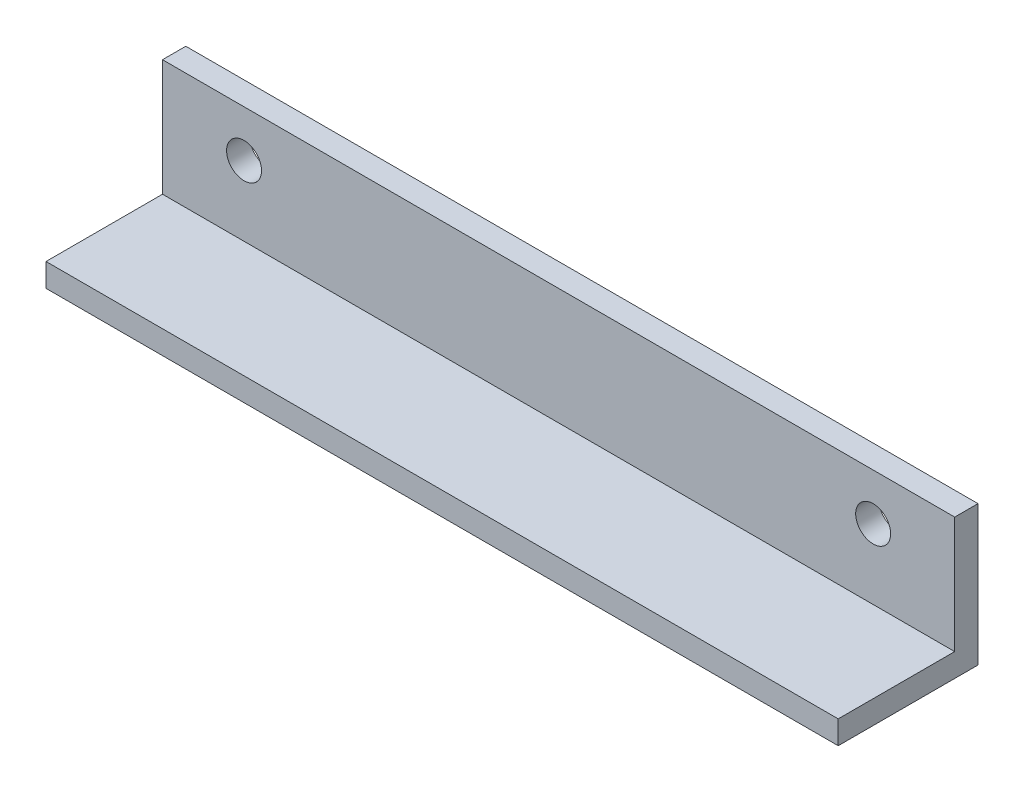
ISO-10303-21;
HEADER;
FILE_DESCRIPTION(('STEP AP214'),'2;1');
FILE_NAME('part.step','',(''),(''),'','','');
FILE_SCHEMA(('AUTOMOTIVE_DESIGN { 1 0 10303 214 1 1 1 1 }'));
ENDSEC;
DATA;
#1=APPLICATION_CONTEXT('core data for automotive mechanical design processes');
#2=APPLICATION_PROTOCOL_DEFINITION('international standard','automotive_design',2000,#1);
#3=PRODUCT_CONTEXT('',#1,'mechanical');
#4=PRODUCT('Part','Part','',(#3));
#5=PRODUCT_RELATED_PRODUCT_CATEGORY('part','',(#4));
#6=PRODUCT_DEFINITION_FORMATION('','',#4);
#7=PRODUCT_DEFINITION_CONTEXT('part definition',#1,'design');
#8=PRODUCT_DEFINITION('design','',#6,#7);
#9=PRODUCT_DEFINITION_SHAPE('','',#8);
#10=(LENGTH_UNIT() NAMED_UNIT(*) SI_UNIT(.MILLI.,.METRE.));
#11=(NAMED_UNIT(*) PLANE_ANGLE_UNIT() SI_UNIT($,.RADIAN.));
#12=(NAMED_UNIT(*) SI_UNIT($,.STERADIAN.) SOLID_ANGLE_UNIT());
#13=UNCERTAINTY_MEASURE_WITH_UNIT(LENGTH_MEASURE(1.E-05),#10,'distance_accuracy_value','');
#14=(GEOMETRIC_REPRESENTATION_CONTEXT(3) GLOBAL_UNCERTAINTY_ASSIGNED_CONTEXT((#13)) GLOBAL_UNIT_ASSIGNED_CONTEXT((#10,
#11,#12)) REPRESENTATION_CONTEXT('',''));
#15=CARTESIAN_POINT('',(0.,0.,0.));
#16=DIRECTION('',(0.,0.,1.));
#17=DIRECTION('',(1.,0.,0.));
#18=AXIS2_PLACEMENT_3D('',#15,#16,#17);
#19=CARTESIAN_POINT('',(107.95,0.,0.));
#20=DIRECTION('',(0.,0.,1.));
#21=DIRECTION('',(1.,0.,0.));
#22=AXIS2_PLACEMENT_3D('',#19,#20,#21);
#23=PLANE('',#22);
#24=CARTESIAN_POINT('',(-85.725,25.4,0.));
#25=DIRECTION('',(0.,0.,1.));
#26=DIRECTION('',(1.,0.,0.));
#27=AXIS2_PLACEMENT_3D('',#24,#25,#26);
#28=CIRCLE('',#27,4.7625);
#29=CARTESIAN_POINT('',(-80.9625,25.4,0.));
#30=VERTEX_POINT('',#29);
#31=EDGE_CURVE('E161',#30,#30,#28,.T.);
#32=ORIENTED_EDGE('',*,*,#31,.T.);
#33=EDGE_LOOP('',(#32));
#34=FACE_BOUND('',#33,.T.);
#35=CARTESIAN_POINT('',(85.725,25.4,0.));
#36=DIRECTION('',(0.,0.,1.));
#37=DIRECTION('',(1.,0.,0.));
#38=AXIS2_PLACEMENT_3D('',#35,#36,#37);
#39=CIRCLE('',#38,4.7625);
#40=CARTESIAN_POINT('',(90.4875,25.4,0.));
#41=VERTEX_POINT('',#40);
#42=EDGE_CURVE('E120',#41,#41,#39,.T.);
#43=ORIENTED_EDGE('',*,*,#42,.T.);
#44=EDGE_LOOP('',(#43));
#45=FACE_BOUND('',#44,.T.);
#46=DIRECTION('',(0.,1.,0.));
#47=VECTOR('',#46,1.);
#48=CARTESIAN_POINT('',(-107.95,0.,0.));
#49=LINE('',#48,#47);
#50=CARTESIAN_POINT('',(-107.95,0.,0.));
#51=VERTEX_POINT('',#50);
#52=CARTESIAN_POINT('',(-107.95,38.1,0.));
#53=VERTEX_POINT('',#52);
#54=EDGE_CURVE('E116',#51,#53,#49,.T.);
#55=ORIENTED_EDGE('',*,*,#54,.T.);
#56=DIRECTION('',(-1.,0.,0.));
#57=VECTOR('',#56,1.);
#58=CARTESIAN_POINT('',(107.95,38.1,0.));
#59=LINE('',#58,#57);
#60=CARTESIAN_POINT('',(107.95,38.1,0.));
#61=VERTEX_POINT('',#60);
#62=EDGE_CURVE('E11',#61,#53,#59,.T.);
#63=ORIENTED_EDGE('',*,*,#62,.F.);
#64=DIRECTION('',(0.,1.,0.));
#65=VECTOR('',#64,1.);
#66=CARTESIAN_POINT('',(107.95,0.,0.));
#67=LINE('',#66,#65);
#68=CARTESIAN_POINT('',(107.95,0.,0.));
#69=VERTEX_POINT('',#68);
#70=EDGE_CURVE('E81',#69,#61,#67,.T.);
#71=ORIENTED_EDGE('',*,*,#70,.F.);
#72=DIRECTION('',(-1.,0.,0.));
#73=VECTOR('',#72,1.);
#74=CARTESIAN_POINT('',(107.95,0.,0.));
#75=LINE('',#74,#73);
#76=EDGE_CURVE('E112',#69,#51,#75,.T.);
#77=ORIENTED_EDGE('',*,*,#76,.T.);
#78=EDGE_LOOP('',(#55,#63,#71,#77));
#79=FACE_BOUND('',#78,.T.);
#80=ADVANCED_FACE('F35',(#34,#45,#79),#23,.F.);
#81=CARTESIAN_POINT('',(107.95,38.1,6.35));
#82=DIRECTION('',(0.,1.,0.));
#83=DIRECTION('',(0.,0.,1.));
#84=AXIS2_PLACEMENT_3D('',#81,#82,#83);
#85=PLANE('',#84);
#86=DIRECTION('',(0.,0.,-1.));
#87=VECTOR('',#86,1.);
#88=CARTESIAN_POINT('',(-107.95,38.1,6.35));
#89=LINE('',#88,#87);
#90=CARTESIAN_POINT('',(-107.95,38.1,6.35));
#91=VERTEX_POINT('',#90);
#92=EDGE_CURVE('E119',#91,#53,#89,.T.);
#93=ORIENTED_EDGE('',*,*,#92,.F.);
#94=DIRECTION('',(-1.,0.,0.));
#95=VECTOR('',#94,1.);
#96=CARTESIAN_POINT('',(107.95,38.1,6.35));
#97=LINE('',#96,#95);
#98=CARTESIAN_POINT('',(107.95,38.1,6.35));
#99=VERTEX_POINT('',#98);
#100=EDGE_CURVE('E43',#99,#91,#97,.T.);
#101=ORIENTED_EDGE('',*,*,#100,.F.);
#102=DIRECTION('',(0.,0.,-1.));
#103=VECTOR('',#102,1.);
#104=CARTESIAN_POINT('',(107.95,38.1,6.35));
#105=LINE('',#104,#103);
#106=EDGE_CURVE('E172',#99,#61,#105,.T.);
#107=ORIENTED_EDGE('',*,*,#106,.T.);
#108=ORIENTED_EDGE('',*,*,#62,.T.);
#109=EDGE_LOOP('',(#93,#101,#107,#108));
#110=FACE_BOUND('',#109,.T.);
#111=ADVANCED_FACE('F138',(#110),#85,.T.);
#112=CARTESIAN_POINT('',(107.95,0.,6.35));
#113=DIRECTION('',(0.,0.,1.));
#114=DIRECTION('',(1.,0.,0.));
#115=AXIS2_PLACEMENT_3D('',#112,#113,#114);
#116=PLANE('',#115);
#117=CARTESIAN_POINT('',(-85.725,25.4,6.35));
#118=DIRECTION('',(0.,0.,1.));
#119=DIRECTION('',(1.,0.,0.));
#120=AXIS2_PLACEMENT_3D('',#117,#118,#119);
#121=CIRCLE('',#120,4.7625);
#122=CARTESIAN_POINT('',(-80.9625,25.4,6.35));
#123=VERTEX_POINT('',#122);
#124=EDGE_CURVE('E174',#123,#123,#121,.T.);
#125=ORIENTED_EDGE('',*,*,#124,.F.);
#126=EDGE_LOOP('',(#125));
#127=FACE_BOUND('',#126,.T.);
#128=CARTESIAN_POINT('',(85.725,25.4,6.35));
#129=DIRECTION('',(0.,0.,1.));
#130=DIRECTION('',(1.,0.,0.));
#131=AXIS2_PLACEMENT_3D('',#128,#129,#130);
#132=CIRCLE('',#131,4.7625);
#133=CARTESIAN_POINT('',(90.4875,25.4,6.35));
#134=VERTEX_POINT('',#133);
#135=EDGE_CURVE('E165',#134,#134,#132,.T.);
#136=ORIENTED_EDGE('',*,*,#135,.F.);
#137=EDGE_LOOP('',(#136));
#138=FACE_BOUND('',#137,.T.);
#139=DIRECTION('',(0.,1.,0.));
#140=VECTOR('',#139,1.);
#141=CARTESIAN_POINT('',(-107.95,0.,6.35));
#142=LINE('',#141,#140);
#143=CARTESIAN_POINT('',(-107.95,6.35,6.35));
#144=VERTEX_POINT('',#143);
#145=EDGE_CURVE('E123',#144,#91,#142,.T.);
#146=ORIENTED_EDGE('',*,*,#145,.F.);
#147=DIRECTION('',(-1.,0.,0.));
#148=VECTOR('',#147,1.);
#149=CARTESIAN_POINT('',(107.95,6.35,6.35));
#150=LINE('',#149,#148);
#151=CARTESIAN_POINT('',(107.95,6.35,6.35));
#152=VERTEX_POINT('',#151);
#153=EDGE_CURVE('E102',#152,#144,#150,.T.);
#154=ORIENTED_EDGE('',*,*,#153,.F.);
#155=DIRECTION('',(0.,1.,0.));
#156=VECTOR('',#155,1.);
#157=CARTESIAN_POINT('',(107.95,0.,6.35));
#158=LINE('',#157,#156);
#159=EDGE_CURVE('E108',#152,#99,#158,.T.);
#160=ORIENTED_EDGE('',*,*,#159,.T.);
#161=ORIENTED_EDGE('',*,*,#100,.T.);
#162=EDGE_LOOP('',(#146,#154,#160,#161));
#163=FACE_BOUND('',#162,.T.);
#164=ADVANCED_FACE('F135',(#127,#138,#163),#116,.T.);
#165=CARTESIAN_POINT('',(107.95,6.35,38.1));
#166=DIRECTION('',(0.,1.,0.));
#167=DIRECTION('',(0.,0.,1.));
#168=AXIS2_PLACEMENT_3D('',#165,#166,#167);
#169=PLANE('',#168);
#170=DIRECTION('',(0.,0.,-1.));
#171=VECTOR('',#170,1.);
#172=CARTESIAN_POINT('',(-107.95,6.35,38.1));
#173=LINE('',#172,#171);
#174=CARTESIAN_POINT('',(-107.95,6.35,38.1));
#175=VERTEX_POINT('',#174);
#176=EDGE_CURVE('E97',#175,#144,#173,.T.);
#177=ORIENTED_EDGE('',*,*,#176,.F.);
#178=DIRECTION('',(-1.,0.,0.));
#179=VECTOR('',#178,1.);
#180=CARTESIAN_POINT('',(107.95,6.35,38.1));
#181=LINE('',#180,#179);
#182=CARTESIAN_POINT('',(107.95,6.35,38.1));
#183=VERTEX_POINT('',#182);
#184=EDGE_CURVE('E92',#183,#175,#181,.T.);
#185=ORIENTED_EDGE('',*,*,#184,.F.);
#186=DIRECTION('',(0.,0.,-1.));
#187=VECTOR('',#186,1.);
#188=CARTESIAN_POINT('',(107.95,6.35,38.1));
#189=LINE('',#188,#187);
#190=EDGE_CURVE('E95',#183,#152,#189,.T.);
#191=ORIENTED_EDGE('',*,*,#190,.T.);
#192=ORIENTED_EDGE('',*,*,#153,.T.);
#193=EDGE_LOOP('',(#177,#185,#191,#192));
#194=FACE_BOUND('',#193,.T.);
#195=ADVANCED_FACE('F94',(#194),#169,.T.);
#196=CARTESIAN_POINT('',(107.95,0.,38.1));
#197=DIRECTION('',(0.,0.,1.));
#198=DIRECTION('',(1.,0.,0.));
#199=AXIS2_PLACEMENT_3D('',#196,#197,#198);
#200=PLANE('',#199);
#201=DIRECTION('',(0.,1.,0.));
#202=VECTOR('',#201,1.);
#203=CARTESIAN_POINT('',(-107.95,0.,38.1));
#204=LINE('',#203,#202);
#205=CARTESIAN_POINT('',(-107.95,0.,38.1));
#206=VERTEX_POINT('',#205);
#207=EDGE_CURVE('E127',#206,#175,#204,.T.);
#208=ORIENTED_EDGE('',*,*,#207,.F.);
#209=DIRECTION('',(-1.,0.,0.));
#210=VECTOR('',#209,1.);
#211=CARTESIAN_POINT('',(107.95,0.,38.1));
#212=LINE('',#211,#210);
#213=CARTESIAN_POINT('',(107.95,0.,38.1));
#214=VERTEX_POINT('',#213);
#215=EDGE_CURVE('E72',#214,#206,#212,.T.);
#216=ORIENTED_EDGE('',*,*,#215,.F.);
#217=DIRECTION('',(0.,1.,0.));
#218=VECTOR('',#217,1.);
#219=CARTESIAN_POINT('',(107.95,0.,38.1));
#220=LINE('',#219,#218);
#221=EDGE_CURVE('E106',#214,#183,#220,.T.);
#222=ORIENTED_EDGE('',*,*,#221,.T.);
#223=ORIENTED_EDGE('',*,*,#184,.T.);
#224=EDGE_LOOP('',(#208,#216,#222,#223));
#225=FACE_BOUND('',#224,.T.);
#226=ADVANCED_FACE('F110',(#225),#200,.T.);
#227=CARTESIAN_POINT('',(107.95,0.,38.1));
#228=DIRECTION('',(0.,1.,0.));
#229=DIRECTION('',(0.,0.,1.));
#230=AXIS2_PLACEMENT_3D('',#227,#228,#229);
#231=PLANE('',#230);
#232=DIRECTION('',(0.,0.,-1.));
#233=VECTOR('',#232,1.);
#234=CARTESIAN_POINT('',(-107.95,0.,38.1));
#235=LINE('',#234,#233);
#236=EDGE_CURVE('E75',#206,#51,#235,.T.);
#237=ORIENTED_EDGE('',*,*,#236,.T.);
#238=ORIENTED_EDGE('',*,*,#76,.F.);
#239=DIRECTION('',(0.,0.,-1.));
#240=VECTOR('',#239,1.);
#241=CARTESIAN_POINT('',(107.95,0.,38.1));
#242=LINE('',#241,#240);
#243=EDGE_CURVE('E51',#214,#69,#242,.T.);
#244=ORIENTED_EDGE('',*,*,#243,.F.);
#245=ORIENTED_EDGE('',*,*,#215,.T.);
#246=EDGE_LOOP('',(#237,#238,#244,#245));
#247=FACE_BOUND('',#246,.T.);
#248=ADVANCED_FACE('F143',(#247),#231,.F.);
#249=CARTESIAN_POINT('',(107.95,0.,0.));
#250=DIRECTION('',(-1.,0.,0.));
#251=DIRECTION('',(0.,0.,1.));
#252=AXIS2_PLACEMENT_3D('',#249,#250,#251);
#253=PLANE('',#252);
#254=ORIENTED_EDGE('',*,*,#70,.T.);
#255=ORIENTED_EDGE('',*,*,#106,.F.);
#256=ORIENTED_EDGE('',*,*,#159,.F.);
#257=ORIENTED_EDGE('',*,*,#190,.F.);
#258=ORIENTED_EDGE('',*,*,#221,.F.);
#259=ORIENTED_EDGE('',*,*,#243,.T.);
#260=EDGE_LOOP('',(#254,#255,#256,#257,#258,#259));
#261=FACE_BOUND('',#260,.T.);
#262=ADVANCED_FACE('F105',(#261),#253,.F.);
#263=CARTESIAN_POINT('',(-107.95,0.,0.));
#264=DIRECTION('',(-1.,0.,0.));
#265=DIRECTION('',(0.,0.,1.));
#266=AXIS2_PLACEMENT_3D('',#263,#264,#265);
#267=PLANE('',#266);
#268=ORIENTED_EDGE('',*,*,#54,.F.);
#269=ORIENTED_EDGE('',*,*,#236,.F.);
#270=ORIENTED_EDGE('',*,*,#207,.T.);
#271=ORIENTED_EDGE('',*,*,#176,.T.);
#272=ORIENTED_EDGE('',*,*,#145,.T.);
#273=ORIENTED_EDGE('',*,*,#92,.T.);
#274=EDGE_LOOP('',(#268,#269,#270,#271,#272,#273));
#275=FACE_BOUND('',#274,.T.);
#276=ADVANCED_FACE('F141',(#275),#267,.T.);
#277=CARTESIAN_POINT('',(85.725,25.4,6.35));
#278=DIRECTION('',(0.,0.,1.));
#279=DIRECTION('',(1.,0.,0.));
#280=AXIS2_PLACEMENT_3D('',#277,#278,#279);
#281=CYLINDRICAL_SURFACE('',#280,4.7625);
#282=ORIENTED_EDGE('',*,*,#42,.F.);
#283=EDGE_LOOP('',(#282));
#284=FACE_BOUND('',#283,.T.);
#285=ORIENTED_EDGE('',*,*,#135,.T.);
#286=EDGE_LOOP('',(#285));
#287=FACE_BOUND('',#286,.T.);
#288=ADVANCED_FACE('F185',(#284,#287),#281,.F.);
#289=CARTESIAN_POINT('',(-85.725,25.4,6.35));
#290=DIRECTION('',(0.,0.,1.));
#291=DIRECTION('',(1.,0.,0.));
#292=AXIS2_PLACEMENT_3D('',#289,#290,#291);
#293=CYLINDRICAL_SURFACE('',#292,4.7625);
#294=ORIENTED_EDGE('',*,*,#31,.F.);
#295=EDGE_LOOP('',(#294));
#296=FACE_BOUND('',#295,.T.);
#297=ORIENTED_EDGE('',*,*,#124,.T.);
#298=EDGE_LOOP('',(#297));
#299=FACE_BOUND('',#298,.T.);
#300=ADVANCED_FACE('F178',(#296,#299),#293,.F.);
#301=CLOSED_SHELL('',(#80,#111,#164,#195,#226,#248,#262,#276,#288,#300));
#302=MANIFOLD_SOLID_BREP('B2',#301);
#303=ADVANCED_BREP_SHAPE_REPRESENTATION('',(#18,#302),#14);
#304=SHAPE_DEFINITION_REPRESENTATION(#9,#303);
ENDSEC;
END-ISO-10303-21;
